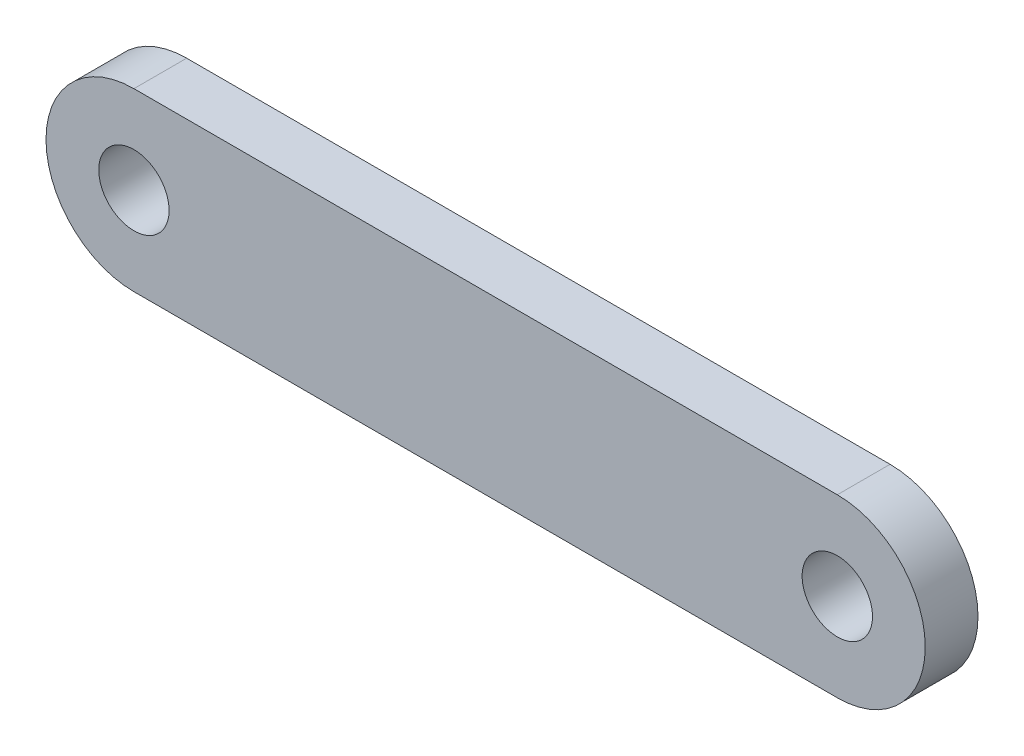
ISO-10303-21;
HEADER;
FILE_DESCRIPTION(('STEP AP214'),'2;1');
FILE_NAME('part.step','',(''),(''),'','','');
FILE_SCHEMA(('AUTOMOTIVE_DESIGN { 1 0 10303 214 1 1 1 1 }'));
ENDSEC;
DATA;
#1=APPLICATION_CONTEXT('core data for automotive mechanical design processes');
#2=APPLICATION_PROTOCOL_DEFINITION('international standard','automotive_design',2000,#1);
#3=PRODUCT_CONTEXT('',#1,'mechanical');
#4=PRODUCT('Part','Part','',(#3));
#5=PRODUCT_RELATED_PRODUCT_CATEGORY('part','',(#4));
#6=PRODUCT_DEFINITION_FORMATION('','',#4);
#7=PRODUCT_DEFINITION_CONTEXT('part definition',#1,'design');
#8=PRODUCT_DEFINITION('design','',#6,#7);
#9=PRODUCT_DEFINITION_SHAPE('','',#8);
#10=(LENGTH_UNIT() NAMED_UNIT(*) SI_UNIT(.MILLI.,.METRE.));
#11=(NAMED_UNIT(*) PLANE_ANGLE_UNIT() SI_UNIT($,.RADIAN.));
#12=(NAMED_UNIT(*) SI_UNIT($,.STERADIAN.) SOLID_ANGLE_UNIT());
#13=UNCERTAINTY_MEASURE_WITH_UNIT(LENGTH_MEASURE(1.E-05),#10,'distance_accuracy_value','');
#14=(GEOMETRIC_REPRESENTATION_CONTEXT(3) GLOBAL_UNCERTAINTY_ASSIGNED_CONTEXT((#13)) GLOBAL_UNIT_ASSIGNED_CONTEXT((#10,
#11,#12)) REPRESENTATION_CONTEXT('',''));
#15=CARTESIAN_POINT('',(0.,0.,0.));
#16=DIRECTION('',(0.,0.,1.));
#17=DIRECTION('',(1.,0.,0.));
#18=AXIS2_PLACEMENT_3D('',#15,#16,#17);
#19=CARTESIAN_POINT('',(0.,5.,3.));
#20=DIRECTION('',(0.,0.,-1.));
#21=DIRECTION('',(-1.,0.,0.));
#22=AXIS2_PLACEMENT_3D('',#19,#20,#21);
#23=PLANE('',#22);
#24=CARTESIAN_POINT('',(0.,5.,3.));
#25=DIRECTION('',(0.,0.,1.));
#26=DIRECTION('',(-1.,0.,0.));
#27=AXIS2_PLACEMENT_3D('',#24,#25,#26);
#28=CIRCLE('',#27,5.);
#29=CARTESIAN_POINT('',(0.,10.,3.));
#30=VERTEX_POINT('',#29);
#31=CARTESIAN_POINT('',(0.,0.,3.));
#32=VERTEX_POINT('',#31);
#33=EDGE_CURVE('E85',#30,#32,#28,.T.);
#34=ORIENTED_EDGE('',*,*,#33,.T.);
#35=DIRECTION('',(1.,0.,0.));
#36=VECTOR('',#35,1.);
#37=CARTESIAN_POINT('',(0.,0.,3.));
#38=LINE('',#37,#36);
#39=CARTESIAN_POINT('',(40.,0.,3.));
#40=VERTEX_POINT('',#39);
#41=EDGE_CURVE('E80',#32,#40,#38,.T.);
#42=ORIENTED_EDGE('',*,*,#41,.T.);
#43=CARTESIAN_POINT('',(40.,5.,3.));
#44=DIRECTION('',(0.,0.,1.));
#45=DIRECTION('',(-1.,0.,0.));
#46=AXIS2_PLACEMENT_3D('',#43,#44,#45);
#47=CIRCLE('',#46,5.);
#48=CARTESIAN_POINT('',(40.,10.,3.));
#49=VERTEX_POINT('',#48);
#50=EDGE_CURVE('E83',#40,#49,#47,.T.);
#51=ORIENTED_EDGE('',*,*,#50,.T.);
#52=DIRECTION('',(-1.,0.,0.));
#53=VECTOR('',#52,1.);
#54=CARTESIAN_POINT('',(0.,10.,3.));
#55=LINE('',#54,#53);
#56=EDGE_CURVE('E50',#49,#30,#55,.T.);
#57=ORIENTED_EDGE('',*,*,#56,.T.);
#58=EDGE_LOOP('',(#34,#42,#51,#57));
#59=FACE_BOUND('',#58,.T.);
#60=CARTESIAN_POINT('',(0.,5.,3.));
#61=DIRECTION('',(0.,0.,1.));
#62=DIRECTION('',(1.,0.,0.));
#63=AXIS2_PLACEMENT_3D('',#60,#61,#62);
#64=CIRCLE('',#63,2.);
#65=CARTESIAN_POINT('',(2.,5.,3.));
#66=VERTEX_POINT('',#65);
#67=EDGE_CURVE('E100',#66,#66,#64,.T.);
#68=ORIENTED_EDGE('',*,*,#67,.F.);
#69=EDGE_LOOP('',(#68));
#70=FACE_BOUND('',#69,.T.);
#71=CARTESIAN_POINT('',(40.,5.,3.));
#72=DIRECTION('',(0.,0.,1.));
#73=DIRECTION('',(1.,0.,0.));
#74=AXIS2_PLACEMENT_3D('',#71,#72,#73);
#75=CIRCLE('',#74,2.);
#76=CARTESIAN_POINT('',(42.,5.,3.));
#77=VERTEX_POINT('',#76);
#78=EDGE_CURVE('E115',#77,#77,#75,.T.);
#79=ORIENTED_EDGE('',*,*,#78,.F.);
#80=EDGE_LOOP('',(#79));
#81=FACE_BOUND('',#80,.T.);
#82=ADVANCED_FACE('F33',(#59,#70,#81),#23,.F.);
#83=CARTESIAN_POINT('',(0.,5.,0.));
#84=DIRECTION('',(0.,0.,-1.));
#85=DIRECTION('',(-1.,0.,0.));
#86=AXIS2_PLACEMENT_3D('',#83,#84,#85);
#87=PLANE('',#86);
#88=CARTESIAN_POINT('',(0.,5.,0.));
#89=DIRECTION('',(0.,0.,1.));
#90=DIRECTION('',(1.,0.,0.));
#91=AXIS2_PLACEMENT_3D('',#88,#89,#90);
#92=CIRCLE('',#91,2.);
#93=CARTESIAN_POINT('',(2.,5.,0.));
#94=VERTEX_POINT('',#93);
#95=EDGE_CURVE('E112',#94,#94,#92,.T.);
#96=ORIENTED_EDGE('',*,*,#95,.T.);
#97=EDGE_LOOP('',(#96));
#98=FACE_BOUND('',#97,.T.);
#99=CARTESIAN_POINT('',(0.,5.,0.));
#100=DIRECTION('',(0.,0.,1.));
#101=DIRECTION('',(-1.,0.,0.));
#102=AXIS2_PLACEMENT_3D('',#99,#100,#101);
#103=CIRCLE('',#102,5.);
#104=CARTESIAN_POINT('',(0.,10.,0.));
#105=VERTEX_POINT('',#104);
#106=CARTESIAN_POINT('',(0.,0.,0.));
#107=VERTEX_POINT('',#106);
#108=EDGE_CURVE('E97',#105,#107,#103,.T.);
#109=ORIENTED_EDGE('',*,*,#108,.F.);
#110=DIRECTION('',(-1.,0.,0.));
#111=VECTOR('',#110,1.);
#112=CARTESIAN_POINT('',(0.,10.,0.));
#113=LINE('',#112,#111);
#114=CARTESIAN_POINT('',(40.,10.,0.));
#115=VERTEX_POINT('',#114);
#116=EDGE_CURVE('E73',#115,#105,#113,.T.);
#117=ORIENTED_EDGE('',*,*,#116,.F.);
#118=CARTESIAN_POINT('',(40.,5.,0.));
#119=DIRECTION('',(0.,0.,1.));
#120=DIRECTION('',(-1.,0.,0.));
#121=AXIS2_PLACEMENT_3D('',#118,#119,#120);
#122=CIRCLE('',#121,5.);
#123=CARTESIAN_POINT('',(40.,0.,0.));
#124=VERTEX_POINT('',#123);
#125=EDGE_CURVE('E67',#124,#115,#122,.T.);
#126=ORIENTED_EDGE('',*,*,#125,.F.);
#127=DIRECTION('',(1.,0.,0.));
#128=VECTOR('',#127,1.);
#129=CARTESIAN_POINT('',(0.,0.,0.));
#130=LINE('',#129,#128);
#131=EDGE_CURVE('E89',#107,#124,#130,.T.);
#132=ORIENTED_EDGE('',*,*,#131,.F.);
#133=EDGE_LOOP('',(#109,#117,#126,#132));
#134=FACE_BOUND('',#133,.T.);
#135=CARTESIAN_POINT('',(40.,5.,0.));
#136=DIRECTION('',(0.,0.,1.));
#137=DIRECTION('',(1.,0.,0.));
#138=AXIS2_PLACEMENT_3D('',#135,#136,#137);
#139=CIRCLE('',#138,2.);
#140=CARTESIAN_POINT('',(42.,5.,0.));
#141=VERTEX_POINT('',#140);
#142=EDGE_CURVE('E118',#141,#141,#139,.T.);
#143=ORIENTED_EDGE('',*,*,#142,.T.);
#144=EDGE_LOOP('',(#143));
#145=FACE_BOUND('',#144,.T.);
#146=ADVANCED_FACE('F108',(#98,#134,#145),#87,.T.);
#147=CARTESIAN_POINT('',(0.,5.,3.));
#148=DIRECTION('',(0.,0.,-1.));
#149=DIRECTION('',(-1.,0.,0.));
#150=AXIS2_PLACEMENT_3D('',#147,#148,#149);
#151=CYLINDRICAL_SURFACE('',#150,5.);
#152=ORIENTED_EDGE('',*,*,#108,.T.);
#153=DIRECTION('',(0.,0.,-1.));
#154=VECTOR('',#153,1.);
#155=CARTESIAN_POINT('',(0.,0.,3.));
#156=LINE('',#155,#154);
#157=EDGE_CURVE('E11',#32,#107,#156,.T.);
#158=ORIENTED_EDGE('',*,*,#157,.F.);
#159=ORIENTED_EDGE('',*,*,#33,.F.);
#160=DIRECTION('',(0.,0.,-1.));
#161=VECTOR('',#160,1.);
#162=CARTESIAN_POINT('',(0.,10.,3.));
#163=LINE('',#162,#161);
#164=EDGE_CURVE('E93',#30,#105,#163,.T.);
#165=ORIENTED_EDGE('',*,*,#164,.T.);
#166=EDGE_LOOP('',(#152,#158,#159,#165));
#167=FACE_BOUND('',#166,.T.);
#168=ADVANCED_FACE('F35',(#167),#151,.T.);
#169=CARTESIAN_POINT('',(0.,0.,3.));
#170=DIRECTION('',(0.,1.,0.));
#171=DIRECTION('',(0.,0.,1.));
#172=AXIS2_PLACEMENT_3D('',#169,#170,#171);
#173=PLANE('',#172);
#174=ORIENTED_EDGE('',*,*,#131,.T.);
#175=DIRECTION('',(0.,0.,-1.));
#176=VECTOR('',#175,1.);
#177=CARTESIAN_POINT('',(40.,0.,3.));
#178=LINE('',#177,#176);
#179=EDGE_CURVE('E42',#40,#124,#178,.T.);
#180=ORIENTED_EDGE('',*,*,#179,.F.);
#181=ORIENTED_EDGE('',*,*,#41,.F.);
#182=ORIENTED_EDGE('',*,*,#157,.T.);
#183=EDGE_LOOP('',(#174,#180,#181,#182));
#184=FACE_BOUND('',#183,.T.);
#185=ADVANCED_FACE('F88',(#184),#173,.F.);
#186=CARTESIAN_POINT('',(40.,5.,3.));
#187=DIRECTION('',(0.,0.,-1.));
#188=DIRECTION('',(-1.,0.,0.));
#189=AXIS2_PLACEMENT_3D('',#186,#187,#188);
#190=CYLINDRICAL_SURFACE('',#189,5.);
#191=ORIENTED_EDGE('',*,*,#125,.T.);
#192=DIRECTION('',(0.,0.,-1.));
#193=VECTOR('',#192,1.);
#194=CARTESIAN_POINT('',(40.,10.,3.));
#195=LINE('',#194,#193);
#196=EDGE_CURVE('E90',#49,#115,#195,.T.);
#197=ORIENTED_EDGE('',*,*,#196,.F.);
#198=ORIENTED_EDGE('',*,*,#50,.F.);
#199=ORIENTED_EDGE('',*,*,#179,.T.);
#200=EDGE_LOOP('',(#191,#197,#198,#199));
#201=FACE_BOUND('',#200,.T.);
#202=ADVANCED_FACE('F91',(#201),#190,.T.);
#203=CARTESIAN_POINT('',(0.,10.,3.));
#204=DIRECTION('',(0.,-1.,0.));
#205=DIRECTION('',(1.,0.,0.));
#206=AXIS2_PLACEMENT_3D('',#203,#204,#205);
#207=PLANE('',#206);
#208=ORIENTED_EDGE('',*,*,#116,.T.);
#209=ORIENTED_EDGE('',*,*,#164,.F.);
#210=ORIENTED_EDGE('',*,*,#56,.F.);
#211=ORIENTED_EDGE('',*,*,#196,.T.);
#212=EDGE_LOOP('',(#208,#209,#210,#211));
#213=FACE_BOUND('',#212,.T.);
#214=ADVANCED_FACE('F105',(#213),#207,.F.);
#215=CARTESIAN_POINT('',(0.,5.,3.));
#216=DIRECTION('',(0.,0.,-1.));
#217=DIRECTION('',(-1.,0.,0.));
#218=AXIS2_PLACEMENT_3D('',#215,#216,#217);
#219=CYLINDRICAL_SURFACE('',#218,2.);
#220=ORIENTED_EDGE('',*,*,#67,.T.);
#221=EDGE_LOOP('',(#220));
#222=FACE_BOUND('',#221,.T.);
#223=ORIENTED_EDGE('',*,*,#95,.F.);
#224=EDGE_LOOP('',(#223));
#225=FACE_BOUND('',#224,.T.);
#226=ADVANCED_FACE('F135',(#222,#225),#219,.F.);
#227=CARTESIAN_POINT('',(40.,5.,3.));
#228=DIRECTION('',(0.,0.,-1.));
#229=DIRECTION('',(-1.,0.,0.));
#230=AXIS2_PLACEMENT_3D('',#227,#228,#229);
#231=CYLINDRICAL_SURFACE('',#230,2.);
#232=ORIENTED_EDGE('',*,*,#78,.T.);
#233=EDGE_LOOP('',(#232));
#234=FACE_BOUND('',#233,.T.);
#235=ORIENTED_EDGE('',*,*,#142,.F.);
#236=EDGE_LOOP('',(#235));
#237=FACE_BOUND('',#236,.T.);
#238=ADVANCED_FACE('F124',(#234,#237),#231,.F.);
#239=CLOSED_SHELL('',(#82,#146,#168,#185,#202,#214,#226,#238));
#240=MANIFOLD_SOLID_BREP('B2',#239);
#241=ADVANCED_BREP_SHAPE_REPRESENTATION('',(#18,#240),#14);
#242=SHAPE_DEFINITION_REPRESENTATION(#9,#241);
ENDSEC;
END-ISO-10303-21;
